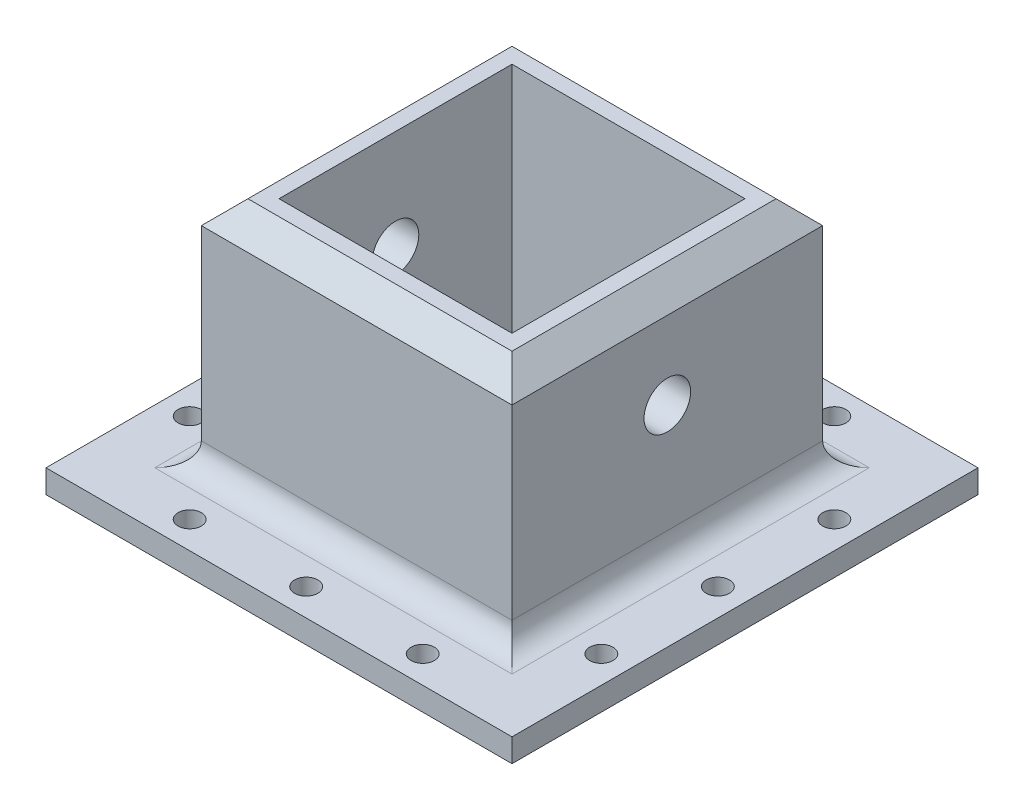
ISO-10303-21;
HEADER;
FILE_DESCRIPTION(('STEP AP214'),'2;1');
FILE_NAME('part.step','',(''),(''),'','','');
FILE_SCHEMA(('AUTOMOTIVE_DESIGN { 1 0 10303 214 1 1 1 1 }'));
ENDSEC;
DATA;
#1=APPLICATION_CONTEXT('core data for automotive mechanical design processes');
#2=APPLICATION_PROTOCOL_DEFINITION('international standard','automotive_design',2000,#1);
#3=PRODUCT_CONTEXT('',#1,'mechanical');
#4=PRODUCT('Part','Part','',(#3));
#5=PRODUCT_RELATED_PRODUCT_CATEGORY('part','',(#4));
#6=PRODUCT_DEFINITION_FORMATION('','',#4);
#7=PRODUCT_DEFINITION_CONTEXT('part definition',#1,'design');
#8=PRODUCT_DEFINITION('design','',#6,#7);
#9=PRODUCT_DEFINITION_SHAPE('','',#8);
#10=(LENGTH_UNIT() NAMED_UNIT(*) SI_UNIT(.MILLI.,.METRE.));
#11=(NAMED_UNIT(*) PLANE_ANGLE_UNIT() SI_UNIT($,.RADIAN.));
#12=(NAMED_UNIT(*) SI_UNIT($,.STERADIAN.) SOLID_ANGLE_UNIT());
#13=UNCERTAINTY_MEASURE_WITH_UNIT(LENGTH_MEASURE(1.E-05),#10,'distance_accuracy_value','');
#14=(GEOMETRIC_REPRESENTATION_CONTEXT(3) GLOBAL_UNCERTAINTY_ASSIGNED_CONTEXT((#13)) GLOBAL_UNIT_ASSIGNED_CONTEXT((#10,
#11,#12)) REPRESENTATION_CONTEXT('',''));
#15=CARTESIAN_POINT('',(0.,0.,0.));
#16=DIRECTION('',(0.,0.,1.));
#17=DIRECTION('',(1.,0.,0.));
#18=AXIS2_PLACEMENT_3D('',#15,#16,#17);
#19=CARTESIAN_POINT('',(0.,3.,0.));
#20=DIRECTION('',(0.,-1.,0.));
#21=DIRECTION('',(0.,0.,-1.));
#22=AXIS2_PLACEMENT_3D('',#19,#20,#21);
#23=PLANE('',#22);
#24=CARTESIAN_POINT('',(-26.4999999999992,3.,15.0000000000008));
#25=DIRECTION('',(0.,1.,0.));
#26=DIRECTION('',(0.,0.,-1.));
#27=AXIS2_PLACEMENT_3D('',#24,#25,#26);
#28=CIRCLE('',#27,1.50000000000125);
#29=CARTESIAN_POINT('',(-26.4999999999992,3.,13.4999999999995));
#30=VERTEX_POINT('',#29);
#31=EDGE_CURVE('E747',#30,#30,#28,.T.);
#32=ORIENTED_EDGE('',*,*,#31,.F.);
#33=EDGE_LOOP('',(#32));
#34=FACE_BOUND('',#33,.T.);
#35=CARTESIAN_POINT('',(-26.4999999999993,3.,-14.9999999999992));
#36=DIRECTION('',(0.,1.,0.));
#37=DIRECTION('',(0.,0.,1.));
#38=AXIS2_PLACEMENT_3D('',#35,#36,#37);
#39=CIRCLE('',#38,1.50000000000115);
#40=CARTESIAN_POINT('',(-26.4999999999993,3.,-13.4999999999981));
#41=VERTEX_POINT('',#40);
#42=EDGE_CURVE('E751',#41,#41,#39,.T.);
#43=ORIENTED_EDGE('',*,*,#42,.F.);
#44=EDGE_LOOP('',(#43));
#45=FACE_BOUND('',#44,.T.);
#46=CARTESIAN_POINT('',(-26.4999999999993,3.,7.51552642896836E-13));
#47=DIRECTION('',(0.,1.,0.));
#48=DIRECTION('',(0.,0.,1.));
#49=AXIS2_PLACEMENT_3D('',#46,#47,#48);
#50=CIRCLE('',#49,1.5000000000012);
#51=CARTESIAN_POINT('',(-26.4999999999993,3.,1.50000000000195));
#52=VERTEX_POINT('',#51);
#53=EDGE_CURVE('E764',#52,#52,#50,.T.);
#54=ORIENTED_EDGE('',*,*,#53,.F.);
#55=EDGE_LOOP('',(#54));
#56=FACE_BOUND('',#55,.T.);
#57=CARTESIAN_POINT('',(15.,3.,-26.5));
#58=DIRECTION('',(0.,1.,0.));
#59=DIRECTION('',(0.,0.,1.));
#60=AXIS2_PLACEMENT_3D('',#57,#58,#59);
#61=CIRCLE('',#60,1.5);
#62=CARTESIAN_POINT('',(15.,3.,-25.));
#63=VERTEX_POINT('',#62);
#64=EDGE_CURVE('E771',#63,#63,#61,.T.);
#65=ORIENTED_EDGE('',*,*,#64,.F.);
#66=EDGE_LOOP('',(#65));
#67=FACE_BOUND('',#66,.T.);
#68=CARTESIAN_POINT('',(-15.,3.,-26.5));
#69=DIRECTION('',(0.,1.,0.));
#70=DIRECTION('',(0.,0.,-1.));
#71=AXIS2_PLACEMENT_3D('',#68,#69,#70);
#72=CIRCLE('',#71,1.5);
#73=CARTESIAN_POINT('',(-15.,3.,-28.));
#74=VERTEX_POINT('',#73);
#75=EDGE_CURVE('E774',#74,#74,#72,.T.);
#76=ORIENTED_EDGE('',*,*,#75,.F.);
#77=EDGE_LOOP('',(#76));
#78=FACE_BOUND('',#77,.T.);
#79=CARTESIAN_POINT('',(26.5000000000007,3.,-7.48307328879096E-13));
#80=DIRECTION('',(0.,1.,0.));
#81=DIRECTION('',(0.,0.,1.));
#82=AXIS2_PLACEMENT_3D('',#79,#80,#81);
#83=CIRCLE('',#82,1.50000000000059);
#84=CARTESIAN_POINT('',(26.5000000000007,3.,1.49999999999984));
#85=VERTEX_POINT('',#84);
#86=EDGE_CURVE('E777',#85,#85,#83,.T.);
#87=ORIENTED_EDGE('',*,*,#86,.F.);
#88=EDGE_LOOP('',(#87));
#89=FACE_BOUND('',#88,.T.);
#90=CARTESIAN_POINT('',(26.5000000000007,3.,14.9999999999993));
#91=DIRECTION('',(0.,1.,0.));
#92=DIRECTION('',(0.,0.,1.));
#93=AXIS2_PLACEMENT_3D('',#90,#91,#92);
#94=CIRCLE('',#93,1.50000000000057);
#95=CARTESIAN_POINT('',(26.5000000000007,3.,16.4999999999998));
#96=VERTEX_POINT('',#95);
#97=EDGE_CURVE('E768',#96,#96,#94,.T.);
#98=ORIENTED_EDGE('',*,*,#97,.F.);
#99=EDGE_LOOP('',(#98));
#100=FACE_BOUND('',#99,.T.);
#101=CARTESIAN_POINT('',(15.0000000000015,3.,26.5));
#102=DIRECTION('',(0.,1.,0.));
#103=DIRECTION('',(0.,0.,-1.));
#104=AXIS2_PLACEMENT_3D('',#101,#102,#103);
#105=CIRCLE('',#104,1.50000000000164);
#106=CARTESIAN_POINT('',(15.0000000000015,3.,24.9999999999984));
#107=VERTEX_POINT('',#106);
#108=EDGE_CURVE('E761',#107,#107,#105,.T.);
#109=ORIENTED_EDGE('',*,*,#108,.F.);
#110=EDGE_LOOP('',(#109));
#111=FACE_BOUND('',#110,.T.);
#112=CARTESIAN_POINT('',(-14.9999999999985,3.,26.5));
#113=DIRECTION('',(0.,1.,0.));
#114=DIRECTION('',(0.,0.,1.));
#115=AXIS2_PLACEMENT_3D('',#112,#113,#114);
#116=CIRCLE('',#115,1.50000000000158);
#117=CARTESIAN_POINT('',(-14.9999999999985,3.,28.0000000000016));
#118=VERTEX_POINT('',#117);
#119=EDGE_CURVE('E757',#118,#118,#116,.T.);
#120=ORIENTED_EDGE('',*,*,#119,.F.);
#121=EDGE_LOOP('',(#120));
#122=FACE_BOUND('',#121,.T.);
#123=CARTESIAN_POINT('',(1.49661465775819E-12,3.,26.5));
#124=DIRECTION('',(0.,1.,0.));
#125=DIRECTION('',(0.,0.,1.));
#126=AXIS2_PLACEMENT_3D('',#123,#124,#125);
#127=CIRCLE('',#126,1.50000000000161);
#128=CARTESIAN_POINT('',(1.49661465775819E-12,3.,28.0000000000016));
#129=VERTEX_POINT('',#128);
#130=EDGE_CURVE('E760',#129,#129,#127,.T.);
#131=ORIENTED_EDGE('',*,*,#130,.F.);
#132=EDGE_LOOP('',(#131));
#133=FACE_BOUND('',#132,.T.);
#134=CARTESIAN_POINT('',(26.5000000000007,3.,-15.0000000000007));
#135=DIRECTION('',(0.,1.,0.));
#136=DIRECTION('',(0.,0.,-1.));
#137=AXIS2_PLACEMENT_3D('',#134,#135,#136);
#138=CIRCLE('',#137,1.5000000000006);
#139=CARTESIAN_POINT('',(26.5000000000007,3.,-16.5000000000013));
#140=VERTEX_POINT('',#139);
#141=EDGE_CURVE('E765',#140,#140,#138,.T.);
#142=ORIENTED_EDGE('',*,*,#141,.F.);
#143=EDGE_LOOP('',(#142));
#144=FACE_BOUND('',#143,.T.);
#145=CARTESIAN_POINT('',(0.,3.,-26.5));
#146=DIRECTION('',(0.,1.,0.));
#147=DIRECTION('',(0.,0.,1.));
#148=AXIS2_PLACEMENT_3D('',#145,#146,#147);
#149=CIRCLE('',#148,1.5);
#150=CARTESIAN_POINT('',(0.,3.,-25.));
#151=VERTEX_POINT('',#150);
#152=EDGE_CURVE('E290',#151,#151,#149,.T.);
#153=ORIENTED_EDGE('',*,*,#152,.F.);
#154=EDGE_LOOP('',(#153));
#155=FACE_BOUND('',#154,.T.);
#156=DIRECTION('',(-1.,0.,0.));
#157=VECTOR('',#156,1.);
#158=CARTESIAN_POINT('',(20.,3.,-23.));
#159=LINE('',#158,#157);
#160=CARTESIAN_POINT('',(-23.,3.,-23.));
#161=VERTEX_POINT('',#160);
#162=CARTESIAN_POINT('',(23.,3.,-23.));
#163=VERTEX_POINT('',#162);
#164=EDGE_CURVE('E264',#161,#163,#159,.F.);
#165=ORIENTED_EDGE('',*,*,#164,.T.);
#166=DIRECTION('',(0.,0.,-1.));
#167=VECTOR('',#166,1.);
#168=CARTESIAN_POINT('',(23.,3.,20.));
#169=LINE('',#168,#167);
#170=CARTESIAN_POINT('',(23.,3.,23.));
#171=VERTEX_POINT('',#170);
#172=EDGE_CURVE('E270',#163,#171,#169,.F.);
#173=ORIENTED_EDGE('',*,*,#172,.T.);
#174=DIRECTION('',(1.,0.,0.));
#175=VECTOR('',#174,1.);
#176=CARTESIAN_POINT('',(-20.,3.,23.));
#177=LINE('',#176,#175);
#178=CARTESIAN_POINT('',(-23.,3.,23.));
#179=VERTEX_POINT('',#178);
#180=EDGE_CURVE('E268',#171,#179,#177,.F.);
#181=ORIENTED_EDGE('',*,*,#180,.T.);
#182=DIRECTION('',(0.,0.,1.));
#183=VECTOR('',#182,1.);
#184=CARTESIAN_POINT('',(-23.,3.,-20.));
#185=LINE('',#184,#183);
#186=EDGE_CURVE('E266',#179,#161,#185,.F.);
#187=ORIENTED_EDGE('',*,*,#186,.T.);
#188=EDGE_LOOP('',(#165,#173,#181,#187));
#189=FACE_BOUND('',#188,.T.);
#190=DIRECTION('',(0.,0.,-1.));
#191=VECTOR('',#190,1.);
#192=CARTESIAN_POINT('',(30.,3.,30.));
#193=LINE('',#192,#191);
#194=CARTESIAN_POINT('',(30.,3.,30.));
#195=VERTEX_POINT('',#194);
#196=CARTESIAN_POINT('',(30.,3.,-30.));
#197=VERTEX_POINT('',#196);
#198=EDGE_CURVE('E204',#195,#197,#193,.T.);
#199=ORIENTED_EDGE('',*,*,#198,.T.);
#200=DIRECTION('',(-1.,0.,0.));
#201=VECTOR('',#200,1.);
#202=CARTESIAN_POINT('',(-30.,3.,-30.));
#203=LINE('',#202,#201);
#204=CARTESIAN_POINT('',(-30.,3.,-30.));
#205=VERTEX_POINT('',#204);
#206=EDGE_CURVE('E207',#197,#205,#203,.T.);
#207=ORIENTED_EDGE('',*,*,#206,.T.);
#208=DIRECTION('',(0.,0.,1.));
#209=VECTOR('',#208,1.);
#210=CARTESIAN_POINT('',(-30.,3.,30.));
#211=LINE('',#210,#209);
#212=CARTESIAN_POINT('',(-30.,3.,30.));
#213=VERTEX_POINT('',#212);
#214=EDGE_CURVE('E210',#205,#213,#211,.T.);
#215=ORIENTED_EDGE('',*,*,#214,.T.);
#216=DIRECTION('',(1.,0.,0.));
#217=VECTOR('',#216,1.);
#218=CARTESIAN_POINT('',(-30.,3.,30.));
#219=LINE('',#218,#217);
#220=EDGE_CURVE('E212',#213,#195,#219,.T.);
#221=ORIENTED_EDGE('',*,*,#220,.T.);
#222=EDGE_LOOP('',(#199,#207,#215,#221));
#223=FACE_BOUND('',#222,.T.);
#224=ADVANCED_FACE('F35',(#34,#45,#56,#67,#78,#89,#100,#111,#122,#133,#144,#155,#189,#223),#23,.F.);
#225=CARTESIAN_POINT('',(30.,3.,30.));
#226=DIRECTION('',(-1.,0.,0.));
#227=DIRECTION('',(0.,0.,1.));
#228=AXIS2_PLACEMENT_3D('',#225,#226,#227);
#229=PLANE('',#228);
#230=DIRECTION('',(0.,0.,-1.));
#231=VECTOR('',#230,1.);
#232=CARTESIAN_POINT('',(30.,0.,30.));
#233=LINE('',#232,#231);
#234=CARTESIAN_POINT('',(30.,0.,30.));
#235=VERTEX_POINT('',#234);
#236=CARTESIAN_POINT('',(30.,0.,-30.));
#237=VERTEX_POINT('',#236);
#238=EDGE_CURVE('E203',#235,#237,#233,.T.);
#239=ORIENTED_EDGE('',*,*,#238,.T.);
#240=DIRECTION('',(0.,-1.,0.));
#241=VECTOR('',#240,1.);
#242=CARTESIAN_POINT('',(30.,3.,-30.));
#243=LINE('',#242,#241);
#244=EDGE_CURVE('E230',#197,#237,#243,.T.);
#245=ORIENTED_EDGE('',*,*,#244,.F.);
#246=ORIENTED_EDGE('',*,*,#198,.F.);
#247=DIRECTION('',(0.,-1.,0.));
#248=VECTOR('',#247,1.);
#249=CARTESIAN_POINT('',(30.,3.,30.));
#250=LINE('',#249,#248);
#251=EDGE_CURVE('E214',#195,#235,#250,.T.);
#252=ORIENTED_EDGE('',*,*,#251,.T.);
#253=EDGE_LOOP('',(#239,#245,#246,#252));
#254=FACE_BOUND('',#253,.T.);
#255=ADVANCED_FACE('F357',(#254),#229,.F.);
#256=CARTESIAN_POINT('',(-30.,3.,-30.));
#257=DIRECTION('',(0.,0.,1.));
#258=DIRECTION('',(1.,0.,0.));
#259=AXIS2_PLACEMENT_3D('',#256,#257,#258);
#260=PLANE('',#259);
#261=DIRECTION('',(-1.,0.,0.));
#262=VECTOR('',#261,1.);
#263=CARTESIAN_POINT('',(-30.,0.,-30.));
#264=LINE('',#263,#262);
#265=CARTESIAN_POINT('',(-30.,0.,-30.));
#266=VERTEX_POINT('',#265);
#267=EDGE_CURVE('E217',#237,#266,#264,.T.);
#268=ORIENTED_EDGE('',*,*,#267,.T.);
#269=DIRECTION('',(0.,-1.,0.));
#270=VECTOR('',#269,1.);
#271=CARTESIAN_POINT('',(-30.,3.,-30.));
#272=LINE('',#271,#270);
#273=EDGE_CURVE('E227',#205,#266,#272,.T.);
#274=ORIENTED_EDGE('',*,*,#273,.F.);
#275=ORIENTED_EDGE('',*,*,#206,.F.);
#276=ORIENTED_EDGE('',*,*,#244,.T.);
#277=EDGE_LOOP('',(#268,#274,#275,#276));
#278=FACE_BOUND('',#277,.T.);
#279=ADVANCED_FACE('F368',(#278),#260,.F.);
#280=CARTESIAN_POINT('',(-30.,3.,30.));
#281=DIRECTION('',(1.,0.,0.));
#282=DIRECTION('',(0.,0.,-1.));
#283=AXIS2_PLACEMENT_3D('',#280,#281,#282);
#284=PLANE('',#283);
#285=DIRECTION('',(0.,0.,1.));
#286=VECTOR('',#285,1.);
#287=CARTESIAN_POINT('',(-30.,0.,30.));
#288=LINE('',#287,#286);
#289=CARTESIAN_POINT('',(-30.,0.,30.));
#290=VERTEX_POINT('',#289);
#291=EDGE_CURVE('E219',#266,#290,#288,.T.);
#292=ORIENTED_EDGE('',*,*,#291,.T.);
#293=DIRECTION('',(0.,-1.,0.));
#294=VECTOR('',#293,1.);
#295=CARTESIAN_POINT('',(-30.,3.,30.));
#296=LINE('',#295,#294);
#297=EDGE_CURVE('E224',#213,#290,#296,.T.);
#298=ORIENTED_EDGE('',*,*,#297,.F.);
#299=ORIENTED_EDGE('',*,*,#214,.F.);
#300=ORIENTED_EDGE('',*,*,#273,.T.);
#301=EDGE_LOOP('',(#292,#298,#299,#300));
#302=FACE_BOUND('',#301,.T.);
#303=ADVANCED_FACE('F365',(#302),#284,.F.);
#304=CARTESIAN_POINT('',(-30.,3.,30.));
#305=DIRECTION('',(0.,0.,-1.));
#306=DIRECTION('',(-1.,0.,0.));
#307=AXIS2_PLACEMENT_3D('',#304,#305,#306);
#308=PLANE('',#307);
#309=DIRECTION('',(1.,0.,0.));
#310=VECTOR('',#309,1.);
#311=CARTESIAN_POINT('',(-30.,0.,30.));
#312=LINE('',#311,#310);
#313=EDGE_CURVE('E208',#290,#235,#312,.T.);
#314=ORIENTED_EDGE('',*,*,#313,.T.);
#315=ORIENTED_EDGE('',*,*,#251,.F.);
#316=ORIENTED_EDGE('',*,*,#220,.F.);
#317=ORIENTED_EDGE('',*,*,#297,.T.);
#318=EDGE_LOOP('',(#314,#315,#316,#317));
#319=FACE_BOUND('',#318,.T.);
#320=ADVANCED_FACE('F328',(#319),#308,.F.);
#321=CARTESIAN_POINT('',(0.,0.,0.));
#322=DIRECTION('',(0.,-1.,0.));
#323=DIRECTION('',(0.,0.,-1.));
#324=AXIS2_PLACEMENT_3D('',#321,#322,#323);
#325=PLANE('',#324);
#326=CARTESIAN_POINT('',(-26.4999999999992,0.,15.0000000000008));
#327=DIRECTION('',(0.,-1.,0.));
#328=DIRECTION('',(0.,0.,-1.));
#329=AXIS2_PLACEMENT_3D('',#326,#327,#328);
#330=CIRCLE('',#329,1.50000000000125);
#331=CARTESIAN_POINT('',(-26.4999999999992,0.,13.4999999999995));
#332=VERTEX_POINT('',#331);
#333=EDGE_CURVE('E279',#332,#332,#330,.T.);
#334=ORIENTED_EDGE('',*,*,#333,.F.);
#335=EDGE_LOOP('',(#334));
#336=FACE_BOUND('',#335,.T.);
#337=CARTESIAN_POINT('',(-26.4999999999993,0.,-14.9999999999992));
#338=DIRECTION('',(0.,-1.,0.));
#339=DIRECTION('',(0.,0.,-1.));
#340=AXIS2_PLACEMENT_3D('',#337,#338,#339);
#341=CIRCLE('',#340,1.50000000000115);
#342=CARTESIAN_POINT('',(-26.4999999999993,0.,-16.5000000000004));
#343=VERTEX_POINT('',#342);
#344=EDGE_CURVE('E317',#343,#343,#341,.T.);
#345=ORIENTED_EDGE('',*,*,#344,.F.);
#346=EDGE_LOOP('',(#345));
#347=FACE_BOUND('',#346,.T.);
#348=CARTESIAN_POINT('',(-26.4999999999993,0.,7.51552642896836E-13));
#349=DIRECTION('',(0.,-1.,0.));
#350=DIRECTION('',(0.,0.,-1.));
#351=AXIS2_PLACEMENT_3D('',#348,#349,#350);
#352=CIRCLE('',#351,1.5000000000012);
#353=CARTESIAN_POINT('',(-26.4999999999993,0.,-1.50000000000045));
#354=VERTEX_POINT('',#353);
#355=EDGE_CURVE('E314',#354,#354,#352,.T.);
#356=ORIENTED_EDGE('',*,*,#355,.F.);
#357=EDGE_LOOP('',(#356));
#358=FACE_BOUND('',#357,.T.);
#359=CARTESIAN_POINT('',(15.,0.,-26.5));
#360=DIRECTION('',(0.,-1.,0.));
#361=DIRECTION('',(0.,0.,-1.));
#362=AXIS2_PLACEMENT_3D('',#359,#360,#361);
#363=CIRCLE('',#362,1.5);
#364=CARTESIAN_POINT('',(15.,0.,-28.));
#365=VERTEX_POINT('',#364);
#366=EDGE_CURVE('E311',#365,#365,#363,.T.);
#367=ORIENTED_EDGE('',*,*,#366,.F.);
#368=EDGE_LOOP('',(#367));
#369=FACE_BOUND('',#368,.T.);
#370=CARTESIAN_POINT('',(-15.,0.,-26.5));
#371=DIRECTION('',(0.,-1.,0.));
#372=DIRECTION('',(0.,0.,-1.));
#373=AXIS2_PLACEMENT_3D('',#370,#371,#372);
#374=CIRCLE('',#373,1.5);
#375=CARTESIAN_POINT('',(-15.,0.,-28.));
#376=VERTEX_POINT('',#375);
#377=EDGE_CURVE('E308',#376,#376,#374,.T.);
#378=ORIENTED_EDGE('',*,*,#377,.F.);
#379=EDGE_LOOP('',(#378));
#380=FACE_BOUND('',#379,.T.);
#381=CARTESIAN_POINT('',(26.5000000000007,0.,-7.48307328879096E-13));
#382=DIRECTION('',(0.,-1.,0.));
#383=DIRECTION('',(0.,0.,-1.));
#384=AXIS2_PLACEMENT_3D('',#381,#382,#383);
#385=CIRCLE('',#384,1.50000000000059);
#386=CARTESIAN_POINT('',(26.5000000000007,0.,-1.50000000000133));
#387=VERTEX_POINT('',#386);
#388=EDGE_CURVE('E305',#387,#387,#385,.T.);
#389=ORIENTED_EDGE('',*,*,#388,.F.);
#390=EDGE_LOOP('',(#389));
#391=FACE_BOUND('',#390,.T.);
#392=CARTESIAN_POINT('',(26.5000000000007,0.,14.9999999999993));
#393=DIRECTION('',(0.,-1.,0.));
#394=DIRECTION('',(0.,0.,-1.));
#395=AXIS2_PLACEMENT_3D('',#392,#393,#394);
#396=CIRCLE('',#395,1.50000000000057);
#397=CARTESIAN_POINT('',(26.5000000000007,0.,13.4999999999987));
#398=VERTEX_POINT('',#397);
#399=EDGE_CURVE('E302',#398,#398,#396,.T.);
#400=ORIENTED_EDGE('',*,*,#399,.F.);
#401=EDGE_LOOP('',(#400));
#402=FACE_BOUND('',#401,.T.);
#403=CARTESIAN_POINT('',(15.0000000000015,0.,26.5));
#404=DIRECTION('',(0.,-1.,0.));
#405=DIRECTION('',(0.,0.,-1.));
#406=AXIS2_PLACEMENT_3D('',#403,#404,#405);
#407=CIRCLE('',#406,1.50000000000164);
#408=CARTESIAN_POINT('',(15.0000000000015,0.,24.9999999999984));
#409=VERTEX_POINT('',#408);
#410=EDGE_CURVE('E299',#409,#409,#407,.T.);
#411=ORIENTED_EDGE('',*,*,#410,.F.);
#412=EDGE_LOOP('',(#411));
#413=FACE_BOUND('',#412,.T.);
#414=CARTESIAN_POINT('',(-14.9999999999985,0.,26.5));
#415=DIRECTION('',(0.,-1.,0.));
#416=DIRECTION('',(0.,0.,-1.));
#417=AXIS2_PLACEMENT_3D('',#414,#415,#416);
#418=CIRCLE('',#417,1.50000000000158);
#419=CARTESIAN_POINT('',(-14.9999999999985,0.,24.9999999999984));
#420=VERTEX_POINT('',#419);
#421=EDGE_CURVE('E296',#420,#420,#418,.T.);
#422=ORIENTED_EDGE('',*,*,#421,.F.);
#423=EDGE_LOOP('',(#422));
#424=FACE_BOUND('',#423,.T.);
#425=CARTESIAN_POINT('',(1.49661465775819E-12,0.,26.5));
#426=DIRECTION('',(0.,-1.,0.));
#427=DIRECTION('',(0.,0.,-1.));
#428=AXIS2_PLACEMENT_3D('',#425,#426,#427);
#429=CIRCLE('',#428,1.50000000000161);
#430=CARTESIAN_POINT('',(1.49661465775819E-12,0.,24.9999999999984));
#431=VERTEX_POINT('',#430);
#432=EDGE_CURVE('E293',#431,#431,#429,.T.);
#433=ORIENTED_EDGE('',*,*,#432,.F.);
#434=EDGE_LOOP('',(#433));
#435=FACE_BOUND('',#434,.T.);
#436=CARTESIAN_POINT('',(26.5000000000007,0.,-15.0000000000007));
#437=DIRECTION('',(0.,-1.,0.));
#438=DIRECTION('',(0.,0.,-1.));
#439=AXIS2_PLACEMENT_3D('',#436,#437,#438);
#440=CIRCLE('',#439,1.5000000000006);
#441=CARTESIAN_POINT('',(26.5000000000007,0.,-16.5000000000013));
#442=VERTEX_POINT('',#441);
#443=EDGE_CURVE('E289',#442,#442,#440,.T.);
#444=ORIENTED_EDGE('',*,*,#443,.F.);
#445=EDGE_LOOP('',(#444));
#446=FACE_BOUND('',#445,.T.);
#447=CARTESIAN_POINT('',(0.,0.,-26.5));
#448=DIRECTION('',(0.,-1.,0.));
#449=DIRECTION('',(0.,0.,-1.));
#450=AXIS2_PLACEMENT_3D('',#447,#448,#449);
#451=CIRCLE('',#450,1.5);
#452=CARTESIAN_POINT('',(0.,0.,-28.));
#453=VERTEX_POINT('',#452);
#454=EDGE_CURVE('E286',#453,#453,#451,.T.);
#455=ORIENTED_EDGE('',*,*,#454,.F.);
#456=EDGE_LOOP('',(#455));
#457=FACE_BOUND('',#456,.T.);
#458=ORIENTED_EDGE('',*,*,#238,.F.);
#459=ORIENTED_EDGE('',*,*,#313,.F.);
#460=ORIENTED_EDGE('',*,*,#291,.F.);
#461=ORIENTED_EDGE('',*,*,#267,.F.);
#462=EDGE_LOOP('',(#458,#459,#460,#461));
#463=FACE_BOUND('',#462,.T.);
#464=ADVANCED_FACE('F325',(#336,#347,#358,#369,#380,#391,#402,#413,#424,#435,#446,#457,#463),
#325,.T.);
#465=CARTESIAN_POINT('',(0.,33.,0.));
#466=DIRECTION('',(0.,1.,0.));
#467=DIRECTION('',(0.,0.,1.));
#468=AXIS2_PLACEMENT_3D('',#465,#466,#467);
#469=PLANE('',#468);
#470=DIRECTION('',(-1.,0.,0.));
#471=VECTOR('',#470,1.);
#472=CARTESIAN_POINT('',(-20.,33.,-17.));
#473=LINE('',#472,#471);
#474=CARTESIAN_POINT('',(17.,33.,-17.));
#475=VERTEX_POINT('',#474);
#476=CARTESIAN_POINT('',(-17.,33.,-17.));
#477=VERTEX_POINT('',#476);
#478=EDGE_CURVE('E237',#475,#477,#473,.T.);
#479=ORIENTED_EDGE('',*,*,#478,.T.);
#480=DIRECTION('',(0.,0.,1.));
#481=VECTOR('',#480,1.);
#482=CARTESIAN_POINT('',(-17.,33.,20.));
#483=LINE('',#482,#481);
#484=CARTESIAN_POINT('',(-17.,33.,17.));
#485=VERTEX_POINT('',#484);
#486=EDGE_CURVE('E239',#477,#485,#483,.T.);
#487=ORIENTED_EDGE('',*,*,#486,.T.);
#488=DIRECTION('',(1.,0.,0.));
#489=VECTOR('',#488,1.);
#490=CARTESIAN_POINT('',(20.,33.,17.));
#491=LINE('',#490,#489);
#492=CARTESIAN_POINT('',(17.,33.,17.));
#493=VERTEX_POINT('',#492);
#494=EDGE_CURVE('E233',#485,#493,#491,.T.);
#495=ORIENTED_EDGE('',*,*,#494,.T.);
#496=DIRECTION('',(0.,0.,-1.));
#497=VECTOR('',#496,1.);
#498=CARTESIAN_POINT('',(17.,33.,-20.));
#499=LINE('',#498,#497);
#500=EDGE_CURVE('E235',#493,#475,#499,.T.);
#501=ORIENTED_EDGE('',*,*,#500,.T.);
#502=EDGE_LOOP('',(#479,#487,#495,#501));
#503=FACE_BOUND('',#502,.T.);
#504=DIRECTION('',(-1.,0.,0.));
#505=VECTOR('',#504,1.);
#506=CARTESIAN_POINT('',(-15.,33.,-15.));
#507=LINE('',#506,#505);
#508=CARTESIAN_POINT('',(15.,33.,-15.));
#509=VERTEX_POINT('',#508);
#510=CARTESIAN_POINT('',(-15.,33.,-15.));
#511=VERTEX_POINT('',#510);
#512=EDGE_CURVE('E161',#509,#511,#507,.T.);
#513=ORIENTED_EDGE('',*,*,#512,.F.);
#514=DIRECTION('',(0.,0.,-1.));
#515=VECTOR('',#514,1.);
#516=CARTESIAN_POINT('',(15.,33.,15.));
#517=LINE('',#516,#515);
#518=CARTESIAN_POINT('',(15.,33.,15.));
#519=VERTEX_POINT('',#518);
#520=EDGE_CURVE('E151',#519,#509,#517,.T.);
#521=ORIENTED_EDGE('',*,*,#520,.F.);
#522=DIRECTION('',(1.,0.,0.));
#523=VECTOR('',#522,1.);
#524=CARTESIAN_POINT('',(-15.,33.,15.));
#525=LINE('',#524,#523);
#526=CARTESIAN_POINT('',(-15.,33.,15.));
#527=VERTEX_POINT('',#526);
#528=EDGE_CURVE('E177',#527,#519,#525,.T.);
#529=ORIENTED_EDGE('',*,*,#528,.F.);
#530=DIRECTION('',(0.,0.,1.));
#531=VECTOR('',#530,1.);
#532=CARTESIAN_POINT('',(-15.,33.,15.));
#533=LINE('',#532,#531);
#534=EDGE_CURVE('E175',#511,#527,#533,.T.);
#535=ORIENTED_EDGE('',*,*,#534,.F.);
#536=EDGE_LOOP('',(#513,#521,#529,#535));
#537=FACE_BOUND('',#536,.T.);
#538=ADVANCED_FACE('F173',(#503,#537),#469,.T.);
#539=CARTESIAN_POINT('',(-20.,33.,20.));
#540=DIRECTION('',(0.,0.,-1.));
#541=DIRECTION('',(-1.,0.,0.));
#542=AXIS2_PLACEMENT_3D('',#539,#540,#541);
#543=PLANE('',#542);
#544=DIRECTION('',(0.,-1.,0.));
#545=VECTOR('',#544,1.);
#546=CARTESIAN_POINT('',(-20.,33.,20.));
#547=LINE('',#546,#545);
#548=CARTESIAN_POINT('',(-20.,30.,20.));
#549=VERTEX_POINT('',#548);
#550=CARTESIAN_POINT('',(-20.,6.,20.));
#551=VERTEX_POINT('',#550);
#552=EDGE_CURVE('E169',#549,#551,#547,.T.);
#553=ORIENTED_EDGE('',*,*,#552,.T.);
#554=DIRECTION('',(1.,0.,0.));
#555=VECTOR('',#554,1.);
#556=CARTESIAN_POINT('',(20.,6.,20.));
#557=LINE('',#556,#555);
#558=CARTESIAN_POINT('',(20.,6.,20.));
#559=VERTEX_POINT('',#558);
#560=EDGE_CURVE('E273',#551,#559,#557,.T.);
#561=ORIENTED_EDGE('',*,*,#560,.T.);
#562=DIRECTION('',(0.,-1.,0.));
#563=VECTOR('',#562,1.);
#564=CARTESIAN_POINT('',(20.,33.,20.));
#565=LINE('',#564,#563);
#566=CARTESIAN_POINT('',(20.,30.,20.));
#567=VERTEX_POINT('',#566);
#568=EDGE_CURVE('E200',#567,#559,#565,.T.);
#569=ORIENTED_EDGE('',*,*,#568,.F.);
#570=DIRECTION('',(-1.,0.,0.));
#571=VECTOR('',#570,1.);
#572=CARTESIAN_POINT('',(-20.,30.,20.));
#573=LINE('',#572,#571);
#574=EDGE_CURVE('E249',#567,#549,#573,.T.);
#575=ORIENTED_EDGE('',*,*,#574,.T.);
#576=EDGE_LOOP('',(#553,#561,#569,#575));
#577=FACE_BOUND('',#576,.T.);
#578=ADVANCED_FACE('F414',(#577),#543,.F.);
#579=CARTESIAN_POINT('',(20.,33.,20.));
#580=DIRECTION('',(-1.,0.,0.));
#581=DIRECTION('',(0.,0.,1.));
#582=AXIS2_PLACEMENT_3D('',#579,#580,#581);
#583=PLANE('',#582);
#584=CARTESIAN_POINT('',(20.,20.,0.));
#585=DIRECTION('',(-1.,0.,0.));
#586=DIRECTION('',(0.,0.,1.));
#587=AXIS2_PLACEMENT_3D('',#584,#585,#586);
#588=CIRCLE('',#587,3.);
#589=CARTESIAN_POINT('',(20.,20.,3.));
#590=VERTEX_POINT('',#589);
#591=EDGE_CURVE('E746',#590,#590,#588,.T.);
#592=ORIENTED_EDGE('',*,*,#591,.T.);
#593=EDGE_LOOP('',(#592));
#594=FACE_BOUND('',#593,.T.);
#595=ORIENTED_EDGE('',*,*,#568,.T.);
#596=DIRECTION('',(0.,0.,-1.));
#597=VECTOR('',#596,1.);
#598=CARTESIAN_POINT('',(20.,6.,-20.));
#599=LINE('',#598,#597);
#600=CARTESIAN_POINT('',(20.,6.,-20.));
#601=VERTEX_POINT('',#600);
#602=EDGE_CURVE('E251',#559,#601,#599,.T.);
#603=ORIENTED_EDGE('',*,*,#602,.T.);
#604=DIRECTION('',(0.,-1.,0.));
#605=VECTOR('',#604,1.);
#606=CARTESIAN_POINT('',(20.,33.,-20.));
#607=LINE('',#606,#605);
#608=CARTESIAN_POINT('',(20.,30.,-20.));
#609=VERTEX_POINT('',#608);
#610=EDGE_CURVE('E198',#609,#601,#607,.T.);
#611=ORIENTED_EDGE('',*,*,#610,.F.);
#612=DIRECTION('',(0.,0.,1.));
#613=VECTOR('',#612,1.);
#614=CARTESIAN_POINT('',(20.,30.,20.));
#615=LINE('',#614,#613);
#616=EDGE_CURVE('E247',#609,#567,#615,.T.);
#617=ORIENTED_EDGE('',*,*,#616,.T.);
#618=EDGE_LOOP('',(#595,#603,#611,#617));
#619=FACE_BOUND('',#618,.T.);
#620=ADVANCED_FACE('F422',(#594,#619),#583,.F.);
#621=CARTESIAN_POINT('',(-20.,33.,-20.));
#622=DIRECTION('',(0.,0.,1.));
#623=DIRECTION('',(1.,0.,0.));
#624=AXIS2_PLACEMENT_3D('',#621,#622,#623);
#625=PLANE('',#624);
#626=ORIENTED_EDGE('',*,*,#610,.T.);
#627=DIRECTION('',(-1.,0.,0.));
#628=VECTOR('',#627,1.);
#629=CARTESIAN_POINT('',(-20.,6.,-20.));
#630=LINE('',#629,#628);
#631=CARTESIAN_POINT('',(-20.,6.,-20.));
#632=VERTEX_POINT('',#631);
#633=EDGE_CURVE('E11',#601,#632,#630,.T.);
#634=ORIENTED_EDGE('',*,*,#633,.T.);
#635=DIRECTION('',(0.,-1.,0.));
#636=VECTOR('',#635,1.);
#637=CARTESIAN_POINT('',(-20.,33.,-20.));
#638=LINE('',#637,#636);
#639=CARTESIAN_POINT('',(-20.,30.,-20.));
#640=VERTEX_POINT('',#639);
#641=EDGE_CURVE('E196',#640,#632,#638,.T.);
#642=ORIENTED_EDGE('',*,*,#641,.F.);
#643=DIRECTION('',(1.,0.,0.));
#644=VECTOR('',#643,1.);
#645=CARTESIAN_POINT('',(20.,30.,-20.));
#646=LINE('',#645,#644);
#647=EDGE_CURVE('E245',#640,#609,#646,.T.);
#648=ORIENTED_EDGE('',*,*,#647,.T.);
#649=EDGE_LOOP('',(#626,#634,#642,#648));
#650=FACE_BOUND('',#649,.T.);
#651=ADVANCED_FACE('F418',(#650),#625,.F.);
#652=CARTESIAN_POINT('',(-20.,33.,20.));
#653=DIRECTION('',(1.,0.,0.));
#654=DIRECTION('',(0.,0.,-1.));
#655=AXIS2_PLACEMENT_3D('',#652,#653,#654);
#656=PLANE('',#655);
#657=CARTESIAN_POINT('',(-20.,20.,0.));
#658=DIRECTION('',(1.,0.,0.));
#659=DIRECTION('',(0.,0.,-1.));
#660=AXIS2_PLACEMENT_3D('',#657,#658,#659);
#661=CIRCLE('',#660,3.);
#662=CARTESIAN_POINT('',(-20.,20.,-3.));
#663=VERTEX_POINT('',#662);
#664=EDGE_CURVE('E748',#663,#663,#661,.T.);
#665=ORIENTED_EDGE('',*,*,#664,.T.);
#666=EDGE_LOOP('',(#665));
#667=FACE_BOUND('',#666,.T.);
#668=ORIENTED_EDGE('',*,*,#641,.T.);
#669=DIRECTION('',(0.,0.,1.));
#670=VECTOR('',#669,1.);
#671=CARTESIAN_POINT('',(-20.,6.,20.));
#672=LINE('',#671,#670);
#673=EDGE_CURVE('E44',#632,#551,#672,.T.);
#674=ORIENTED_EDGE('',*,*,#673,.T.);
#675=ORIENTED_EDGE('',*,*,#552,.F.);
#676=DIRECTION('',(0.,0.,-1.));
#677=VECTOR('',#676,1.);
#678=CARTESIAN_POINT('',(-20.,30.,-20.));
#679=LINE('',#678,#677);
#680=EDGE_CURVE('E242',#549,#640,#679,.T.);
#681=ORIENTED_EDGE('',*,*,#680,.T.);
#682=EDGE_LOOP('',(#668,#674,#675,#681));
#683=FACE_BOUND('',#682,.T.);
#684=ADVANCED_FACE('F410',(#667,#683),#656,.F.);
#685=CARTESIAN_POINT('',(15.,33.,15.));
#686=DIRECTION('',(-1.,0.,0.));
#687=DIRECTION('',(0.,0.,1.));
#688=AXIS2_PLACEMENT_3D('',#685,#686,#687);
#689=PLANE('',#688);
#690=CARTESIAN_POINT('',(15.,20.,0.));
#691=DIRECTION('',(-1.,0.,0.));
#692=DIRECTION('',(0.,0.,1.));
#693=AXIS2_PLACEMENT_3D('',#690,#691,#692);
#694=CIRCLE('',#693,3.);
#695=CARTESIAN_POINT('',(15.,20.,3.));
#696=VERTEX_POINT('',#695);
#697=EDGE_CURVE('E743',#696,#696,#694,.T.);
#698=ORIENTED_EDGE('',*,*,#697,.F.);
#699=EDGE_LOOP('',(#698));
#700=FACE_BOUND('',#699,.T.);
#701=DIRECTION('',(0.,0.,-1.));
#702=VECTOR('',#701,1.);
#703=CARTESIAN_POINT('',(15.,3.,15.));
#704=LINE('',#703,#702);
#705=CARTESIAN_POINT('',(15.,3.,15.));
#706=VERTEX_POINT('',#705);
#707=CARTESIAN_POINT('',(15.,3.,-15.));
#708=VERTEX_POINT('',#707);
#709=EDGE_CURVE('E182',#706,#708,#704,.T.);
#710=ORIENTED_EDGE('',*,*,#709,.F.);
#711=DIRECTION('',(0.,-1.,0.));
#712=VECTOR('',#711,1.);
#713=CARTESIAN_POINT('',(15.,33.,15.));
#714=LINE('',#713,#712);
#715=EDGE_CURVE('E157',#519,#706,#714,.T.);
#716=ORIENTED_EDGE('',*,*,#715,.F.);
#717=ORIENTED_EDGE('',*,*,#520,.T.);
#718=DIRECTION('',(0.,-1.,0.));
#719=VECTOR('',#718,1.);
#720=CARTESIAN_POINT('',(15.,33.,-15.));
#721=LINE('',#720,#719);
#722=EDGE_CURVE('E155',#509,#708,#721,.T.);
#723=ORIENTED_EDGE('',*,*,#722,.T.);
#724=EDGE_LOOP('',(#710,#716,#717,#723));
#725=FACE_BOUND('',#724,.T.);
#726=ADVANCED_FACE('F154',(#700,#725),#689,.T.);
#727=CARTESIAN_POINT('',(-15.,33.,-15.));
#728=DIRECTION('',(0.,0.,1.));
#729=DIRECTION('',(1.,0.,0.));
#730=AXIS2_PLACEMENT_3D('',#727,#728,#729);
#731=PLANE('',#730);
#732=DIRECTION('',(-1.,0.,0.));
#733=VECTOR('',#732,1.);
#734=CARTESIAN_POINT('',(-15.,3.,-15.));
#735=LINE('',#734,#733);
#736=CARTESIAN_POINT('',(-15.,3.,-15.));
#737=VERTEX_POINT('',#736);
#738=EDGE_CURVE('E168',#708,#737,#735,.T.);
#739=ORIENTED_EDGE('',*,*,#738,.F.);
#740=ORIENTED_EDGE('',*,*,#722,.F.);
#741=ORIENTED_EDGE('',*,*,#512,.T.);
#742=DIRECTION('',(0.,-1.,0.));
#743=VECTOR('',#742,1.);
#744=CARTESIAN_POINT('',(-15.,33.,-15.));
#745=LINE('',#744,#743);
#746=EDGE_CURVE('E170',#511,#737,#745,.T.);
#747=ORIENTED_EDGE('',*,*,#746,.T.);
#748=EDGE_LOOP('',(#739,#740,#741,#747));
#749=FACE_BOUND('',#748,.T.);
#750=ADVANCED_FACE('F165',(#749),#731,.T.);
#751=CARTESIAN_POINT('',(-15.,33.,15.));
#752=DIRECTION('',(1.,0.,0.));
#753=DIRECTION('',(0.,0.,-1.));
#754=AXIS2_PLACEMENT_3D('',#751,#752,#753);
#755=PLANE('',#754);
#756=CARTESIAN_POINT('',(-15.,20.,0.));
#757=DIRECTION('',(1.,0.,0.));
#758=DIRECTION('',(0.,0.,-1.));
#759=AXIS2_PLACEMENT_3D('',#756,#757,#758);
#760=CIRCLE('',#759,3.);
#761=CARTESIAN_POINT('',(-15.,20.,-3.));
#762=VERTEX_POINT('',#761);
#763=EDGE_CURVE('E39',#762,#762,#760,.T.);
#764=ORIENTED_EDGE('',*,*,#763,.F.);
#765=EDGE_LOOP('',(#764));
#766=FACE_BOUND('',#765,.T.);
#767=DIRECTION('',(0.,0.,1.));
#768=VECTOR('',#767,1.);
#769=CARTESIAN_POINT('',(-15.,3.,15.));
#770=LINE('',#769,#768);
#771=CARTESIAN_POINT('',(-15.,3.,15.));
#772=VERTEX_POINT('',#771);
#773=EDGE_CURVE('E186',#737,#772,#770,.T.);
#774=ORIENTED_EDGE('',*,*,#773,.F.);
#775=ORIENTED_EDGE('',*,*,#746,.F.);
#776=ORIENTED_EDGE('',*,*,#534,.T.);
#777=DIRECTION('',(0.,-1.,0.));
#778=VECTOR('',#777,1.);
#779=CARTESIAN_POINT('',(-15.,33.,15.));
#780=LINE('',#779,#778);
#781=EDGE_CURVE('E192',#527,#772,#780,.T.);
#782=ORIENTED_EDGE('',*,*,#781,.T.);
#783=EDGE_LOOP('',(#774,#775,#776,#782));
#784=FACE_BOUND('',#783,.T.);
#785=ADVANCED_FACE('F392',(#766,#784),#755,.T.);
#786=CARTESIAN_POINT('',(-15.,33.,15.));
#787=DIRECTION('',(0.,0.,-1.));
#788=DIRECTION('',(-1.,0.,0.));
#789=AXIS2_PLACEMENT_3D('',#786,#787,#788);
#790=PLANE('',#789);
#791=DIRECTION('',(1.,0.,0.));
#792=VECTOR('',#791,1.);
#793=CARTESIAN_POINT('',(-15.,3.,15.));
#794=LINE('',#793,#792);
#795=EDGE_CURVE('E162',#772,#706,#794,.T.);
#796=ORIENTED_EDGE('',*,*,#795,.F.);
#797=ORIENTED_EDGE('',*,*,#781,.F.);
#798=ORIENTED_EDGE('',*,*,#528,.T.);
#799=ORIENTED_EDGE('',*,*,#715,.T.);
#800=EDGE_LOOP('',(#796,#797,#798,#799));
#801=FACE_BOUND('',#800,.T.);
#802=ADVANCED_FACE('F383',(#801),#790,.T.);
#803=ORIENTED_EDGE('',*,*,#795,.T.);
#804=ORIENTED_EDGE('',*,*,#709,.T.);
#805=ORIENTED_EDGE('',*,*,#738,.T.);
#806=ORIENTED_EDGE('',*,*,#773,.T.);
#807=EDGE_LOOP('',(#803,#804,#805,#806));
#808=FACE_BOUND('',#807,.T.);
#809=ADVANCED_FACE('F373',(#808),#23,.F.);
#810=CARTESIAN_POINT('',(17.,33.,0.));
#811=DIRECTION('',(0.707106781186549,0.707106781186546,0.));
#812=DIRECTION('',(0.,0.,1.));
#813=AXIS2_PLACEMENT_3D('',#810,#811,#812);
#814=PLANE('',#813);
#815=DIRECTION('',(-0.577350269189625,0.577350269189628,-0.577350269189625));
#816=VECTOR('',#815,1.);
#817=CARTESIAN_POINT('',(11.3333333333334,38.6666666666667,11.3333333333333));
#818=LINE('',#817,#816);
#819=EDGE_CURVE('E257',#567,#493,#818,.T.);
#820=ORIENTED_EDGE('',*,*,#819,.F.);
#821=ORIENTED_EDGE('',*,*,#616,.F.);
#822=DIRECTION('',(-0.577350269189625,0.577350269189628,0.577350269189625));
#823=VECTOR('',#822,1.);
#824=CARTESIAN_POINT('',(11.3333333333334,38.6666666666667,-11.3333333333334));
#825=LINE('',#824,#823);
#826=EDGE_CURVE('E184',#475,#609,#825,.F.);
#827=ORIENTED_EDGE('',*,*,#826,.F.);
#828=ORIENTED_EDGE('',*,*,#500,.F.);
#829=EDGE_LOOP('',(#820,#821,#827,#828));
#830=FACE_BOUND('',#829,.T.);
#831=ADVANCED_FACE('F382',(#830),#814,.T.);
#832=CARTESIAN_POINT('',(0.,33.,-17.));
#833=DIRECTION('',(0.,0.707106781186546,-0.707106781186549));
#834=DIRECTION('',(1.,0.,0.));
#835=AXIS2_PLACEMENT_3D('',#832,#833,#834);
#836=PLANE('',#835);
#837=ORIENTED_EDGE('',*,*,#826,.T.);
#838=ORIENTED_EDGE('',*,*,#647,.F.);
#839=DIRECTION('',(0.577350269189625,0.577350269189628,0.577350269189625));
#840=VECTOR('',#839,1.);
#841=CARTESIAN_POINT('',(-11.3333333333333,38.6666666666667,-11.3333333333334));
#842=LINE('',#841,#840);
#843=EDGE_CURVE('E254',#477,#640,#842,.F.);
#844=ORIENTED_EDGE('',*,*,#843,.F.);
#845=ORIENTED_EDGE('',*,*,#478,.F.);
#846=EDGE_LOOP('',(#837,#838,#844,#845));
#847=FACE_BOUND('',#846,.T.);
#848=ADVANCED_FACE('F389',(#847),#836,.T.);
#849=CARTESIAN_POINT('',(0.,33.,17.));
#850=DIRECTION('',(0.,0.707106781186546,0.707106781186549));
#851=DIRECTION('',(-1.,0.,0.));
#852=AXIS2_PLACEMENT_3D('',#849,#850,#851);
#853=PLANE('',#852);
#854=ORIENTED_EDGE('',*,*,#819,.T.);
#855=ORIENTED_EDGE('',*,*,#494,.F.);
#856=DIRECTION('',(-0.577350269189625,-0.577350269189628,0.577350269189625));
#857=VECTOR('',#856,1.);
#858=CARTESIAN_POINT('',(-11.3333333333333,38.6666666666667,11.3333333333333));
#859=LINE('',#858,#857);
#860=EDGE_CURVE('E252',#549,#485,#859,.F.);
#861=ORIENTED_EDGE('',*,*,#860,.F.);
#862=ORIENTED_EDGE('',*,*,#574,.F.);
#863=EDGE_LOOP('',(#854,#855,#861,#862));
#864=FACE_BOUND('',#863,.T.);
#865=ADVANCED_FACE('F460',(#864),#853,.T.);
#866=CARTESIAN_POINT('',(-17.,33.,0.));
#867=DIRECTION('',(-0.707106781186549,0.707106781186546,0.));
#868=DIRECTION('',(0.,0.,-1.));
#869=AXIS2_PLACEMENT_3D('',#866,#867,#868);
#870=PLANE('',#869);
#871=ORIENTED_EDGE('',*,*,#843,.T.);
#872=ORIENTED_EDGE('',*,*,#680,.F.);
#873=ORIENTED_EDGE('',*,*,#860,.T.);
#874=ORIENTED_EDGE('',*,*,#486,.F.);
#875=EDGE_LOOP('',(#871,#872,#873,#874));
#876=FACE_BOUND('',#875,.T.);
#877=ADVANCED_FACE('F457',(#876),#870,.T.);
#878=CARTESIAN_POINT('',(-23.,6.,20.));
#879=DIRECTION('',(0.,0.,-1.));
#880=DIRECTION('',(-1.,0.,0.));
#881=AXIS2_PLACEMENT_3D('',#878,#879,#880);
#882=CYLINDRICAL_SURFACE('',#881,3.);
#883=CARTESIAN_POINT('',(-23.,6.,-23.));
#884=DIRECTION('',(0.707106781186547,0.,-0.707106781186547));
#885=DIRECTION('',(0.707106781186548,0.,0.707106781186547));
#886=AXIS2_PLACEMENT_3D('',#883,#884,#885);
#887=ELLIPSE('',#886,4.24264068711928,3.);
#888=EDGE_CURVE('E281',#161,#632,#887,.F.);
#889=ORIENTED_EDGE('',*,*,#888,.F.);
#890=ORIENTED_EDGE('',*,*,#186,.F.);
#891=CARTESIAN_POINT('',(-23.,6.,23.));
#892=DIRECTION('',(-0.707106781186547,0.,-0.707106781186547));
#893=DIRECTION('',(0.707106781186547,0.,-0.707106781186547));
#894=AXIS2_PLACEMENT_3D('',#891,#892,#893);
#895=ELLIPSE('',#894,4.24264068711928,3.);
#896=EDGE_CURVE('E255',#551,#179,#895,.T.);
#897=ORIENTED_EDGE('',*,*,#896,.F.);
#898=ORIENTED_EDGE('',*,*,#673,.F.);
#899=EDGE_LOOP('',(#889,#890,#897,#898));
#900=FACE_BOUND('',#899,.T.);
#901=ADVANCED_FACE('F37',(#900),#882,.F.);
#902=CARTESIAN_POINT('',(-20.,6.,23.));
#903=DIRECTION('',(-1.,0.,0.));
#904=DIRECTION('',(0.,0.,1.));
#905=AXIS2_PLACEMENT_3D('',#902,#903,#904);
#906=CYLINDRICAL_SURFACE('',#905,3.);
#907=ORIENTED_EDGE('',*,*,#896,.T.);
#908=ORIENTED_EDGE('',*,*,#180,.F.);
#909=CARTESIAN_POINT('',(23.,6.,23.));
#910=DIRECTION('',(-0.707106781186547,0.,0.707106781186548));
#911=DIRECTION('',(-0.707106781186547,0.,-0.707106781186547));
#912=AXIS2_PLACEMENT_3D('',#909,#910,#911);
#913=ELLIPSE('',#912,4.24264068711929,3.);
#914=EDGE_CURVE('E278',#559,#171,#913,.T.);
#915=ORIENTED_EDGE('',*,*,#914,.F.);
#916=ORIENTED_EDGE('',*,*,#560,.F.);
#917=EDGE_LOOP('',(#907,#908,#915,#916));
#918=FACE_BOUND('',#917,.T.);
#919=ADVANCED_FACE('F440',(#918),#906,.F.);
#920=CARTESIAN_POINT('',(-20.,6.,-23.));
#921=DIRECTION('',(1.,0.,0.));
#922=DIRECTION('',(0.,0.,-1.));
#923=AXIS2_PLACEMENT_3D('',#920,#921,#922);
#924=CYLINDRICAL_SURFACE('',#923,3.);
#925=ORIENTED_EDGE('',*,*,#888,.T.);
#926=ORIENTED_EDGE('',*,*,#633,.F.);
#927=CARTESIAN_POINT('',(23.,6.,-23.));
#928=DIRECTION('',(0.707106781186548,0.,0.707106781186547));
#929=DIRECTION('',(0.707106781186547,0.,-0.707106781186548));
#930=AXIS2_PLACEMENT_3D('',#927,#928,#929);
#931=ELLIPSE('',#930,4.24264068711928,3.);
#932=EDGE_CURVE('E276',#163,#601,#931,.F.);
#933=ORIENTED_EDGE('',*,*,#932,.F.);
#934=ORIENTED_EDGE('',*,*,#164,.F.);
#935=EDGE_LOOP('',(#925,#926,#933,#934));
#936=FACE_BOUND('',#935,.T.);
#937=ADVANCED_FACE('F485',(#936),#924,.F.);
#938=CARTESIAN_POINT('',(23.,6.,20.));
#939=DIRECTION('',(0.,0.,1.));
#940=DIRECTION('',(1.,0.,0.));
#941=AXIS2_PLACEMENT_3D('',#938,#939,#940);
#942=CYLINDRICAL_SURFACE('',#941,3.);
#943=ORIENTED_EDGE('',*,*,#914,.T.);
#944=ORIENTED_EDGE('',*,*,#172,.F.);
#945=ORIENTED_EDGE('',*,*,#932,.T.);
#946=ORIENTED_EDGE('',*,*,#602,.F.);
#947=EDGE_LOOP('',(#943,#944,#945,#946));
#948=FACE_BOUND('',#947,.T.);
#949=ADVANCED_FACE('F444',(#948),#942,.F.);
#950=CARTESIAN_POINT('',(0.,-27.,-26.5));
#951=DIRECTION('',(0.,1.,0.));
#952=DIRECTION('',(0.,0.,1.));
#953=AXIS2_PLACEMENT_3D('',#950,#951,#952);
#954=CYLINDRICAL_SURFACE('',#953,1.5);
#955=ORIENTED_EDGE('',*,*,#454,.T.);
#956=EDGE_LOOP('',(#955));
#957=FACE_BOUND('',#956,.T.);
#958=ORIENTED_EDGE('',*,*,#152,.T.);
#959=EDGE_LOOP('',(#958));
#960=FACE_BOUND('',#959,.T.);
#961=ADVANCED_FACE('F484',(#957,#960),#954,.F.);
#962=CARTESIAN_POINT('',(26.5000000000007,-27.,-15.0000000000007));
#963=DIRECTION('',(0.,1.,0.));
#964=DIRECTION('',(0.,0.,1.));
#965=AXIS2_PLACEMENT_3D('',#962,#963,#964);
#966=CYLINDRICAL_SURFACE('',#965,1.5000000000006);
#967=ORIENTED_EDGE('',*,*,#443,.T.);
#968=EDGE_LOOP('',(#967));
#969=FACE_BOUND('',#968,.T.);
#970=ORIENTED_EDGE('',*,*,#141,.T.);
#971=EDGE_LOOP('',(#970));
#972=FACE_BOUND('',#971,.T.);
#973=ADVANCED_FACE('F606',(#969,#972),#966,.F.);
#974=CARTESIAN_POINT('',(1.49661465775819E-12,-27.,26.5));
#975=DIRECTION('',(0.,1.,0.));
#976=DIRECTION('',(0.,0.,1.));
#977=AXIS2_PLACEMENT_3D('',#974,#975,#976);
#978=CYLINDRICAL_SURFACE('',#977,1.50000000000161);
#979=ORIENTED_EDGE('',*,*,#432,.T.);
#980=EDGE_LOOP('',(#979));
#981=FACE_BOUND('',#980,.T.);
#982=ORIENTED_EDGE('',*,*,#130,.T.);
#983=EDGE_LOOP('',(#982));
#984=FACE_BOUND('',#983,.T.);
#985=ADVANCED_FACE('F616',(#981,#984),#978,.F.);
#986=CARTESIAN_POINT('',(-14.9999999999985,-27.,26.5));
#987=DIRECTION('',(0.,1.,0.));
#988=DIRECTION('',(0.,0.,1.));
#989=AXIS2_PLACEMENT_3D('',#986,#987,#988);
#990=CYLINDRICAL_SURFACE('',#989,1.50000000000158);
#991=ORIENTED_EDGE('',*,*,#421,.T.);
#992=EDGE_LOOP('',(#991));
#993=FACE_BOUND('',#992,.T.);
#994=ORIENTED_EDGE('',*,*,#119,.T.);
#995=EDGE_LOOP('',(#994));
#996=FACE_BOUND('',#995,.T.);
#997=ADVANCED_FACE('F626',(#993,#996),#990,.F.);
#998=CARTESIAN_POINT('',(15.0000000000015,-27.,26.5));
#999=DIRECTION('',(0.,1.,0.));
#1000=DIRECTION('',(0.,0.,1.));
#1001=AXIS2_PLACEMENT_3D('',#998,#999,#1000);
#1002=CYLINDRICAL_SURFACE('',#1001,1.50000000000164);
#1003=ORIENTED_EDGE('',*,*,#410,.T.);
#1004=EDGE_LOOP('',(#1003));
#1005=FACE_BOUND('',#1004,.T.);
#1006=ORIENTED_EDGE('',*,*,#108,.T.);
#1007=EDGE_LOOP('',(#1006));
#1008=FACE_BOUND('',#1007,.T.);
#1009=ADVANCED_FACE('F636',(#1005,#1008),#1002,.F.);
#1010=CARTESIAN_POINT('',(26.5000000000007,-27.,14.9999999999993));
#1011=DIRECTION('',(0.,1.,0.));
#1012=DIRECTION('',(0.,0.,1.));
#1013=AXIS2_PLACEMENT_3D('',#1010,#1011,#1012);
#1014=CYLINDRICAL_SURFACE('',#1013,1.50000000000057);
#1015=ORIENTED_EDGE('',*,*,#399,.T.);
#1016=EDGE_LOOP('',(#1015));
#1017=FACE_BOUND('',#1016,.T.);
#1018=ORIENTED_EDGE('',*,*,#97,.T.);
#1019=EDGE_LOOP('',(#1018));
#1020=FACE_BOUND('',#1019,.T.);
#1021=ADVANCED_FACE('F646',(#1017,#1020),#1014,.F.);
#1022=CARTESIAN_POINT('',(26.5000000000007,-27.,-7.48307328879096E-13));
#1023=DIRECTION('',(0.,1.,0.));
#1024=DIRECTION('',(0.,0.,1.));
#1025=AXIS2_PLACEMENT_3D('',#1022,#1023,#1024);
#1026=CYLINDRICAL_SURFACE('',#1025,1.50000000000059);
#1027=ORIENTED_EDGE('',*,*,#388,.T.);
#1028=EDGE_LOOP('',(#1027));
#1029=FACE_BOUND('',#1028,.T.);
#1030=ORIENTED_EDGE('',*,*,#86,.T.);
#1031=EDGE_LOOP('',(#1030));
#1032=FACE_BOUND('',#1031,.T.);
#1033=ADVANCED_FACE('F656',(#1029,#1032),#1026,.F.);
#1034=CARTESIAN_POINT('',(-15.,-27.,-26.5));
#1035=DIRECTION('',(0.,1.,0.));
#1036=DIRECTION('',(0.,0.,1.));
#1037=AXIS2_PLACEMENT_3D('',#1034,#1035,#1036);
#1038=CYLINDRICAL_SURFACE('',#1037,1.5);
#1039=ORIENTED_EDGE('',*,*,#377,.T.);
#1040=EDGE_LOOP('',(#1039));
#1041=FACE_BOUND('',#1040,.T.);
#1042=ORIENTED_EDGE('',*,*,#75,.T.);
#1043=EDGE_LOOP('',(#1042));
#1044=FACE_BOUND('',#1043,.T.);
#1045=ADVANCED_FACE('F666',(#1041,#1044),#1038,.F.);
#1046=CARTESIAN_POINT('',(15.,-27.,-26.5));
#1047=DIRECTION('',(0.,1.,0.));
#1048=DIRECTION('',(0.,0.,1.));
#1049=AXIS2_PLACEMENT_3D('',#1046,#1047,#1048);
#1050=CYLINDRICAL_SURFACE('',#1049,1.5);
#1051=ORIENTED_EDGE('',*,*,#366,.T.);
#1052=EDGE_LOOP('',(#1051));
#1053=FACE_BOUND('',#1052,.T.);
#1054=ORIENTED_EDGE('',*,*,#64,.T.);
#1055=EDGE_LOOP('',(#1054));
#1056=FACE_BOUND('',#1055,.T.);
#1057=ADVANCED_FACE('F676',(#1053,#1056),#1050,.F.);
#1058=CARTESIAN_POINT('',(-26.4999999999993,-27.,7.51552642896836E-13));
#1059=DIRECTION('',(0.,1.,0.));
#1060=DIRECTION('',(0.,0.,1.));
#1061=AXIS2_PLACEMENT_3D('',#1058,#1059,#1060);
#1062=CYLINDRICAL_SURFACE('',#1061,1.5000000000012);
#1063=ORIENTED_EDGE('',*,*,#355,.T.);
#1064=EDGE_LOOP('',(#1063));
#1065=FACE_BOUND('',#1064,.T.);
#1066=ORIENTED_EDGE('',*,*,#53,.T.);
#1067=EDGE_LOOP('',(#1066));
#1068=FACE_BOUND('',#1067,.T.);
#1069=ADVANCED_FACE('F686',(#1065,#1068),#1062,.F.);
#1070=CARTESIAN_POINT('',(-26.4999999999993,-27.,-14.9999999999992));
#1071=DIRECTION('',(0.,1.,0.));
#1072=DIRECTION('',(0.,0.,1.));
#1073=AXIS2_PLACEMENT_3D('',#1070,#1071,#1072);
#1074=CYLINDRICAL_SURFACE('',#1073,1.50000000000115);
#1075=ORIENTED_EDGE('',*,*,#344,.T.);
#1076=EDGE_LOOP('',(#1075));
#1077=FACE_BOUND('',#1076,.T.);
#1078=ORIENTED_EDGE('',*,*,#42,.T.);
#1079=EDGE_LOOP('',(#1078));
#1080=FACE_BOUND('',#1079,.T.);
#1081=ADVANCED_FACE('F696',(#1077,#1080),#1074,.F.);
#1082=CARTESIAN_POINT('',(-26.4999999999992,-27.,15.0000000000008));
#1083=DIRECTION('',(0.,1.,0.));
#1084=DIRECTION('',(0.,0.,1.));
#1085=AXIS2_PLACEMENT_3D('',#1082,#1083,#1084);
#1086=CYLINDRICAL_SURFACE('',#1085,1.50000000000125);
#1087=ORIENTED_EDGE('',*,*,#333,.T.);
#1088=EDGE_LOOP('',(#1087));
#1089=FACE_BOUND('',#1088,.T.);
#1090=ORIENTED_EDGE('',*,*,#31,.T.);
#1091=EDGE_LOOP('',(#1090));
#1092=FACE_BOUND('',#1091,.T.);
#1093=ADVANCED_FACE('F322',(#1089,#1092),#1086,.F.);
#1094=CARTESIAN_POINT('',(-30.,20.,0.));
#1095=DIRECTION('',(1.,0.,0.));
#1096=DIRECTION('',(0.,0.,-1.));
#1097=AXIS2_PLACEMENT_3D('',#1094,#1095,#1096);
#1098=CYLINDRICAL_SURFACE('',#1097,3.);
#1099=ORIENTED_EDGE('',*,*,#763,.T.);
#1100=EDGE_LOOP('',(#1099));
#1101=FACE_BOUND('',#1100,.T.);
#1102=ORIENTED_EDGE('',*,*,#664,.F.);
#1103=EDGE_LOOP('',(#1102));
#1104=FACE_BOUND('',#1103,.T.);
#1105=ADVANCED_FACE('F714',(#1101,#1104),#1098,.F.);
#1106=ORIENTED_EDGE('',*,*,#697,.T.);
#1107=EDGE_LOOP('',(#1106));
#1108=FACE_BOUND('',#1107,.T.);
#1109=ORIENTED_EDGE('',*,*,#591,.F.);
#1110=EDGE_LOOP('',(#1109));
#1111=FACE_BOUND('',#1110,.T.);
#1112=ADVANCED_FACE('F727',(#1108,#1111),#1098,.F.);
#1113=CLOSED_SHELL('',(#224,#255,#279,#303,#320,#464,#538,#578,#620,#651,#684,#726,#750,#785,
#802,#809,#831,#848,#865,#877,#901,#919,#937,#949,#961,#973,#985,#997,#1009,#1021,#1033,#1045,
#1057,#1069,#1081,#1093,#1105,#1112));
#1114=MANIFOLD_SOLID_BREP('B2',#1113);
#1115=ADVANCED_BREP_SHAPE_REPRESENTATION('',(#18,#1114),#14);
#1116=SHAPE_DEFINITION_REPRESENTATION(#9,#1115);
ENDSEC;
END-ISO-10303-21;
